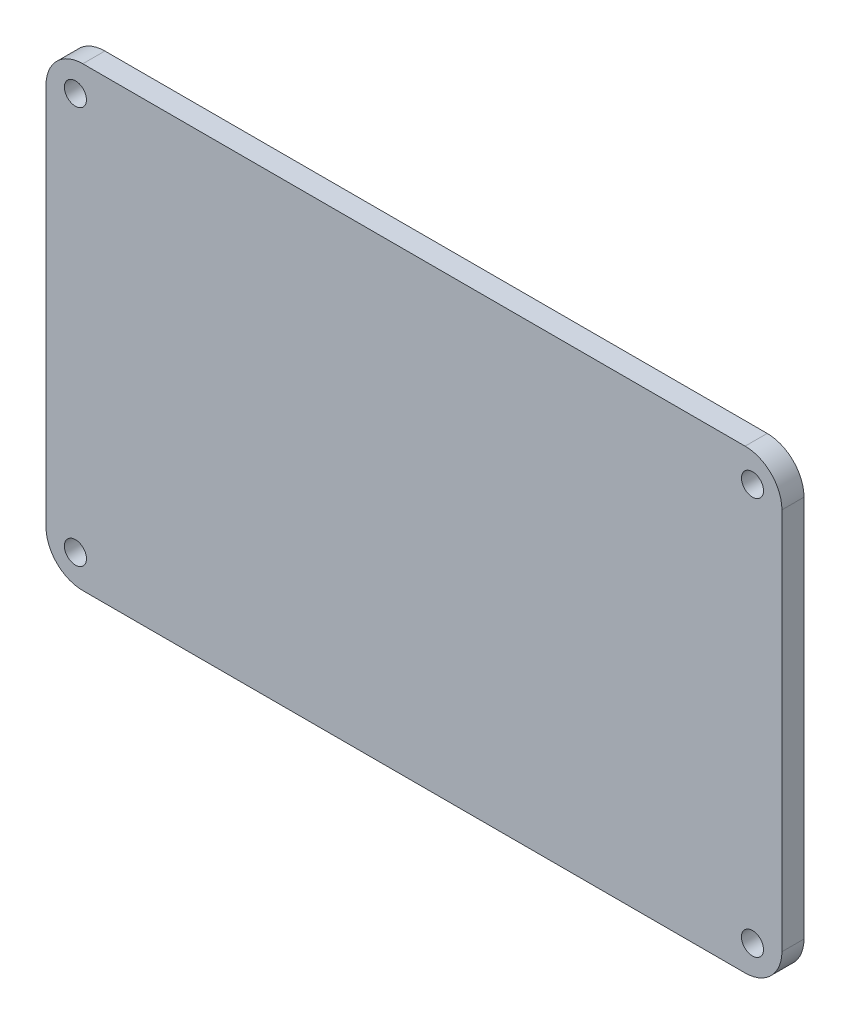
ISO-10303-21;
HEADER;
FILE_DESCRIPTION(('STEP AP214'),'2;1');
FILE_NAME('part.step','',(''),(''),'','','');
FILE_SCHEMA(('AUTOMOTIVE_DESIGN { 1 0 10303 214 1 1 1 1 }'));
ENDSEC;
DATA;
#1=APPLICATION_CONTEXT('core data for automotive mechanical design processes');
#2=APPLICATION_PROTOCOL_DEFINITION('international standard','automotive_design',2000,#1);
#3=PRODUCT_CONTEXT('',#1,'mechanical');
#4=PRODUCT('Part','Part','',(#3));
#5=PRODUCT_RELATED_PRODUCT_CATEGORY('part','',(#4));
#6=PRODUCT_DEFINITION_FORMATION('','',#4);
#7=PRODUCT_DEFINITION_CONTEXT('part definition',#1,'design');
#8=PRODUCT_DEFINITION('design','',#6,#7);
#9=PRODUCT_DEFINITION_SHAPE('','',#8);
#10=(LENGTH_UNIT() NAMED_UNIT(*) SI_UNIT(.MILLI.,.METRE.));
#11=(NAMED_UNIT(*) PLANE_ANGLE_UNIT() SI_UNIT($,.RADIAN.));
#12=(NAMED_UNIT(*) SI_UNIT($,.STERADIAN.) SOLID_ANGLE_UNIT());
#13=UNCERTAINTY_MEASURE_WITH_UNIT(LENGTH_MEASURE(1.E-05),#10,'distance_accuracy_value','');
#14=(GEOMETRIC_REPRESENTATION_CONTEXT(3) GLOBAL_UNCERTAINTY_ASSIGNED_CONTEXT((#13)) GLOBAL_UNIT_ASSIGNED_CONTEXT((#10,
#11,#12)) REPRESENTATION_CONTEXT('',''));
#15=CARTESIAN_POINT('',(0.,0.,0.));
#16=DIRECTION('',(0.,0.,1.));
#17=DIRECTION('',(1.,0.,0.));
#18=AXIS2_PLACEMENT_3D('',#15,#16,#17);
#19=CARTESIAN_POINT('',(-45.,26.,3.));
#20=DIRECTION('',(0.,0.,-1.));
#21=DIRECTION('',(-1.,0.,0.));
#22=AXIS2_PLACEMENT_3D('',#19,#20,#21);
#23=CYLINDRICAL_SURFACE('',#22,5.);
#24=CARTESIAN_POINT('',(-45.,26.,0.));
#25=DIRECTION('',(0.,0.,1.));
#26=DIRECTION('',(-1.,0.,0.));
#27=AXIS2_PLACEMENT_3D('',#24,#25,#26);
#28=CIRCLE('',#27,5.);
#29=CARTESIAN_POINT('',(-45.,31.,0.));
#30=VERTEX_POINT('',#29);
#31=CARTESIAN_POINT('',(-50.,26.,0.));
#32=VERTEX_POINT('',#31);
#33=EDGE_CURVE('E135',#30,#32,#28,.T.);
#34=ORIENTED_EDGE('',*,*,#33,.T.);
#35=DIRECTION('',(0.,0.,-1.));
#36=VECTOR('',#35,1.);
#37=CARTESIAN_POINT('',(-50.,26.,3.));
#38=LINE('',#37,#36);
#39=CARTESIAN_POINT('',(-50.,26.,3.));
#40=VERTEX_POINT('',#39);
#41=EDGE_CURVE('E11',#40,#32,#38,.T.);
#42=ORIENTED_EDGE('',*,*,#41,.F.);
#43=CARTESIAN_POINT('',(-45.,26.,3.));
#44=DIRECTION('',(0.,0.,1.));
#45=DIRECTION('',(-1.,0.,0.));
#46=AXIS2_PLACEMENT_3D('',#43,#44,#45);
#47=CIRCLE('',#46,5.);
#48=CARTESIAN_POINT('',(-45.,31.,3.));
#49=VERTEX_POINT('',#48);
#50=EDGE_CURVE('E150',#49,#40,#47,.T.);
#51=ORIENTED_EDGE('',*,*,#50,.F.);
#52=DIRECTION('',(0.,0.,-1.));
#53=VECTOR('',#52,1.);
#54=CARTESIAN_POINT('',(-45.,31.,3.));
#55=LINE('',#54,#53);
#56=EDGE_CURVE('E131',#49,#30,#55,.T.);
#57=ORIENTED_EDGE('',*,*,#56,.T.);
#58=EDGE_LOOP('',(#34,#42,#51,#57));
#59=FACE_BOUND('',#58,.T.);
#60=ADVANCED_FACE('F39',(#59),#23,.T.);
#61=CARTESIAN_POINT('',(-50.,26.,3.));
#62=DIRECTION('',(1.,0.,0.));
#63=DIRECTION('',(0.,1.,0.));
#64=AXIS2_PLACEMENT_3D('',#61,#62,#63);
#65=PLANE('',#64);
#66=DIRECTION('',(0.,-1.,0.));
#67=VECTOR('',#66,1.);
#68=CARTESIAN_POINT('',(-50.,26.,0.));
#69=LINE('',#68,#67);
#70=CARTESIAN_POINT('',(-50.,-26.,0.));
#71=VERTEX_POINT('',#70);
#72=EDGE_CURVE('E138',#32,#71,#69,.T.);
#73=ORIENTED_EDGE('',*,*,#72,.T.);
#74=DIRECTION('',(0.,0.,-1.));
#75=VECTOR('',#74,1.);
#76=CARTESIAN_POINT('',(-50.,-26.,3.));
#77=LINE('',#76,#75);
#78=CARTESIAN_POINT('',(-50.,-26.,3.));
#79=VERTEX_POINT('',#78);
#80=EDGE_CURVE('E47',#79,#71,#77,.T.);
#81=ORIENTED_EDGE('',*,*,#80,.F.);
#82=DIRECTION('',(0.,-1.,0.));
#83=VECTOR('',#82,1.);
#84=CARTESIAN_POINT('',(-50.,26.,3.));
#85=LINE('',#84,#83);
#86=EDGE_CURVE('E98',#40,#79,#85,.T.);
#87=ORIENTED_EDGE('',*,*,#86,.F.);
#88=ORIENTED_EDGE('',*,*,#41,.T.);
#89=EDGE_LOOP('',(#73,#81,#87,#88));
#90=FACE_BOUND('',#89,.T.);
#91=ADVANCED_FACE('F232',(#90),#65,.F.);
#92=CARTESIAN_POINT('',(-45.,-26.,3.));
#93=DIRECTION('',(0.,0.,-1.));
#94=DIRECTION('',(-1.,0.,0.));
#95=AXIS2_PLACEMENT_3D('',#92,#93,#94);
#96=CYLINDRICAL_SURFACE('',#95,5.);
#97=CARTESIAN_POINT('',(-45.,-26.,0.));
#98=DIRECTION('',(0.,0.,1.));
#99=DIRECTION('',(-1.,0.,0.));
#100=AXIS2_PLACEMENT_3D('',#97,#98,#99);
#101=CIRCLE('',#100,5.);
#102=CARTESIAN_POINT('',(-45.,-31.,0.));
#103=VERTEX_POINT('',#102);
#104=EDGE_CURVE('E141',#71,#103,#101,.T.);
#105=ORIENTED_EDGE('',*,*,#104,.T.);
#106=DIRECTION('',(0.,0.,-1.));
#107=VECTOR('',#106,1.);
#108=CARTESIAN_POINT('',(-45.,-31.,3.));
#109=LINE('',#108,#107);
#110=CARTESIAN_POINT('',(-45.,-31.,3.));
#111=VERTEX_POINT('',#110);
#112=EDGE_CURVE('E157',#111,#103,#109,.T.);
#113=ORIENTED_EDGE('',*,*,#112,.F.);
#114=CARTESIAN_POINT('',(-45.,-26.,3.));
#115=DIRECTION('',(0.,0.,1.));
#116=DIRECTION('',(-1.,0.,0.));
#117=AXIS2_PLACEMENT_3D('',#114,#115,#116);
#118=CIRCLE('',#117,5.);
#119=EDGE_CURVE('E165',#79,#111,#118,.T.);
#120=ORIENTED_EDGE('',*,*,#119,.F.);
#121=ORIENTED_EDGE('',*,*,#80,.T.);
#122=EDGE_LOOP('',(#105,#113,#120,#121));
#123=FACE_BOUND('',#122,.T.);
#124=ADVANCED_FACE('F163',(#123),#96,.T.);
#125=CARTESIAN_POINT('',(-45.,-31.,3.));
#126=DIRECTION('',(0.,1.,0.));
#127=DIRECTION('',(0.,0.,1.));
#128=AXIS2_PLACEMENT_3D('',#125,#126,#127);
#129=PLANE('',#128);
#130=DIRECTION('',(1.,0.,0.));
#131=VECTOR('',#130,1.);
#132=CARTESIAN_POINT('',(-45.,-31.,0.));
#133=LINE('',#132,#131);
#134=CARTESIAN_POINT('',(44.9999999999999,-31.,0.));
#135=VERTEX_POINT('',#134);
#136=EDGE_CURVE('E143',#103,#135,#133,.T.);
#137=ORIENTED_EDGE('',*,*,#136,.T.);
#138=DIRECTION('',(0.,0.,-1.));
#139=VECTOR('',#138,1.);
#140=CARTESIAN_POINT('',(44.9999999999999,-31.,3.));
#141=LINE('',#140,#139);
#142=CARTESIAN_POINT('',(44.9999999999999,-31.,3.));
#143=VERTEX_POINT('',#142);
#144=EDGE_CURVE('E154',#143,#135,#141,.T.);
#145=ORIENTED_EDGE('',*,*,#144,.F.);
#146=DIRECTION('',(1.,0.,0.));
#147=VECTOR('',#146,1.);
#148=CARTESIAN_POINT('',(-45.,-31.,3.));
#149=LINE('',#148,#147);
#150=EDGE_CURVE('E177',#111,#143,#149,.T.);
#151=ORIENTED_EDGE('',*,*,#150,.F.);
#152=ORIENTED_EDGE('',*,*,#112,.T.);
#153=EDGE_LOOP('',(#137,#145,#151,#152));
#154=FACE_BOUND('',#153,.T.);
#155=ADVANCED_FACE('F173',(#154),#129,.F.);
#156=CARTESIAN_POINT('',(45.,-26.,3.));
#157=DIRECTION('',(0.,0.,-1.));
#158=DIRECTION('',(-1.,0.,0.));
#159=AXIS2_PLACEMENT_3D('',#156,#157,#158);
#160=CYLINDRICAL_SURFACE('',#159,5.);
#161=CARTESIAN_POINT('',(45.,-26.,0.));
#162=DIRECTION('',(0.,0.,1.));
#163=DIRECTION('',(1.,0.,0.));
#164=AXIS2_PLACEMENT_3D('',#161,#162,#163);
#165=CIRCLE('',#164,5.);
#166=CARTESIAN_POINT('',(50.,-26.,0.));
#167=VERTEX_POINT('',#166);
#168=EDGE_CURVE('E145',#135,#167,#165,.T.);
#169=ORIENTED_EDGE('',*,*,#168,.T.);
#170=DIRECTION('',(0.,0.,-1.));
#171=VECTOR('',#170,1.);
#172=CARTESIAN_POINT('',(50.,-26.,3.));
#173=LINE('',#172,#171);
#174=CARTESIAN_POINT('',(50.,-26.,3.));
#175=VERTEX_POINT('',#174);
#176=EDGE_CURVE('E126',#175,#167,#173,.T.);
#177=ORIENTED_EDGE('',*,*,#176,.F.);
#178=CARTESIAN_POINT('',(45.,-26.,3.));
#179=DIRECTION('',(0.,0.,1.));
#180=DIRECTION('',(1.,0.,0.));
#181=AXIS2_PLACEMENT_3D('',#178,#179,#180);
#182=CIRCLE('',#181,5.);
#183=EDGE_CURVE('E117',#143,#175,#182,.T.);
#184=ORIENTED_EDGE('',*,*,#183,.F.);
#185=ORIENTED_EDGE('',*,*,#144,.T.);
#186=EDGE_LOOP('',(#169,#177,#184,#185));
#187=FACE_BOUND('',#186,.T.);
#188=ADVANCED_FACE('F176',(#187),#160,.T.);
#189=CARTESIAN_POINT('',(50.,26.,3.));
#190=DIRECTION('',(-1.,0.,0.));
#191=DIRECTION('',(0.,-1.,0.));
#192=AXIS2_PLACEMENT_3D('',#189,#190,#191);
#193=PLANE('',#192);
#194=DIRECTION('',(0.,1.,0.));
#195=VECTOR('',#194,1.);
#196=CARTESIAN_POINT('',(50.,26.,0.));
#197=LINE('',#196,#195);
#198=CARTESIAN_POINT('',(50.,26.,0.));
#199=VERTEX_POINT('',#198);
#200=EDGE_CURVE('E125',#167,#199,#197,.T.);
#201=ORIENTED_EDGE('',*,*,#200,.T.);
#202=DIRECTION('',(0.,0.,-1.));
#203=VECTOR('',#202,1.);
#204=CARTESIAN_POINT('',(50.,26.,3.));
#205=LINE('',#204,#203);
#206=CARTESIAN_POINT('',(50.,26.,3.));
#207=VERTEX_POINT('',#206);
#208=EDGE_CURVE('E122',#207,#199,#205,.T.);
#209=ORIENTED_EDGE('',*,*,#208,.F.);
#210=DIRECTION('',(0.,1.,0.));
#211=VECTOR('',#210,1.);
#212=CARTESIAN_POINT('',(50.,26.,3.));
#213=LINE('',#212,#211);
#214=EDGE_CURVE('E111',#175,#207,#213,.T.);
#215=ORIENTED_EDGE('',*,*,#214,.F.);
#216=ORIENTED_EDGE('',*,*,#176,.T.);
#217=EDGE_LOOP('',(#201,#209,#215,#216));
#218=FACE_BOUND('',#217,.T.);
#219=ADVANCED_FACE('F123',(#218),#193,.F.);
#220=CARTESIAN_POINT('',(45.,26.,3.));
#221=DIRECTION('',(0.,0.,-1.));
#222=DIRECTION('',(-1.,0.,0.));
#223=AXIS2_PLACEMENT_3D('',#220,#221,#222);
#224=CYLINDRICAL_SURFACE('',#223,5.);
#225=CARTESIAN_POINT('',(45.,26.,0.));
#226=DIRECTION('',(0.,0.,1.));
#227=DIRECTION('',(1.,0.,0.));
#228=AXIS2_PLACEMENT_3D('',#225,#226,#227);
#229=CIRCLE('',#228,5.);
#230=CARTESIAN_POINT('',(44.9999999999999,31.,0.));
#231=VERTEX_POINT('',#230);
#232=EDGE_CURVE('E84',#199,#231,#229,.T.);
#233=ORIENTED_EDGE('',*,*,#232,.T.);
#234=DIRECTION('',(0.,0.,-1.));
#235=VECTOR('',#234,1.);
#236=CARTESIAN_POINT('',(44.9999999999999,31.,3.));
#237=LINE('',#236,#235);
#238=CARTESIAN_POINT('',(44.9999999999999,31.,3.));
#239=VERTEX_POINT('',#238);
#240=EDGE_CURVE('E127',#239,#231,#237,.T.);
#241=ORIENTED_EDGE('',*,*,#240,.F.);
#242=CARTESIAN_POINT('',(45.,26.,3.));
#243=DIRECTION('',(0.,0.,1.));
#244=DIRECTION('',(1.,0.,0.));
#245=AXIS2_PLACEMENT_3D('',#242,#243,#244);
#246=CIRCLE('',#245,5.);
#247=EDGE_CURVE('E115',#207,#239,#246,.T.);
#248=ORIENTED_EDGE('',*,*,#247,.F.);
#249=ORIENTED_EDGE('',*,*,#208,.T.);
#250=EDGE_LOOP('',(#233,#241,#248,#249));
#251=FACE_BOUND('',#250,.T.);
#252=ADVANCED_FACE('F129',(#251),#224,.T.);
#253=CARTESIAN_POINT('',(-45.,31.,3.));
#254=DIRECTION('',(0.,-1.,0.));
#255=DIRECTION('',(0.,0.,-1.));
#256=AXIS2_PLACEMENT_3D('',#253,#254,#255);
#257=PLANE('',#256);
#258=DIRECTION('',(-1.,0.,0.));
#259=VECTOR('',#258,1.);
#260=CARTESIAN_POINT('',(-45.,31.,0.));
#261=LINE('',#260,#259);
#262=EDGE_CURVE('E90',#231,#30,#261,.T.);
#263=ORIENTED_EDGE('',*,*,#262,.T.);
#264=ORIENTED_EDGE('',*,*,#56,.F.);
#265=DIRECTION('',(-1.,0.,0.));
#266=VECTOR('',#265,1.);
#267=CARTESIAN_POINT('',(-45.,31.,3.));
#268=LINE('',#267,#266);
#269=EDGE_CURVE('E55',#239,#49,#268,.T.);
#270=ORIENTED_EDGE('',*,*,#269,.F.);
#271=ORIENTED_EDGE('',*,*,#240,.T.);
#272=EDGE_LOOP('',(#263,#264,#270,#271));
#273=FACE_BOUND('',#272,.T.);
#274=ADVANCED_FACE('F211',(#273),#257,.F.);
#275=CARTESIAN_POINT('',(-45.,26.,3.));
#276=DIRECTION('',(0.,0.,-1.));
#277=DIRECTION('',(-1.,0.,0.));
#278=AXIS2_PLACEMENT_3D('',#275,#276,#277);
#279=PLANE('',#278);
#280=CARTESIAN_POINT('',(46.,27.,3.));
#281=DIRECTION('',(0.,0.,1.));
#282=DIRECTION('',(1.,0.,0.));
#283=AXIS2_PLACEMENT_3D('',#280,#281,#282);
#284=CIRCLE('',#283,1.5);
#285=CARTESIAN_POINT('',(47.5,27.,3.));
#286=VERTEX_POINT('',#285);
#287=EDGE_CURVE('E186',#286,#286,#284,.T.);
#288=ORIENTED_EDGE('',*,*,#287,.F.);
#289=EDGE_LOOP('',(#288));
#290=FACE_BOUND('',#289,.T.);
#291=CARTESIAN_POINT('',(-46.,-27.,3.));
#292=DIRECTION('',(0.,0.,1.));
#293=DIRECTION('',(1.,0.,0.));
#294=AXIS2_PLACEMENT_3D('',#291,#292,#293);
#295=CIRCLE('',#294,1.5);
#296=CARTESIAN_POINT('',(-44.5,-27.,3.));
#297=VERTEX_POINT('',#296);
#298=EDGE_CURVE('E192',#297,#297,#295,.T.);
#299=ORIENTED_EDGE('',*,*,#298,.F.);
#300=EDGE_LOOP('',(#299));
#301=FACE_BOUND('',#300,.T.);
#302=CARTESIAN_POINT('',(46.,-27.,3.));
#303=DIRECTION('',(0.,0.,1.));
#304=DIRECTION('',(1.,0.,0.));
#305=AXIS2_PLACEMENT_3D('',#302,#303,#304);
#306=CIRCLE('',#305,1.5);
#307=CARTESIAN_POINT('',(47.5,-27.,3.));
#308=VERTEX_POINT('',#307);
#309=EDGE_CURVE('E193',#308,#308,#306,.T.);
#310=ORIENTED_EDGE('',*,*,#309,.F.);
#311=EDGE_LOOP('',(#310));
#312=FACE_BOUND('',#311,.T.);
#313=CARTESIAN_POINT('',(-46.,27.,3.));
#314=DIRECTION('',(0.,0.,1.));
#315=DIRECTION('',(1.,0.,0.));
#316=AXIS2_PLACEMENT_3D('',#313,#314,#315);
#317=CIRCLE('',#316,1.5);
#318=CARTESIAN_POINT('',(-44.5,27.,3.));
#319=VERTEX_POINT('',#318);
#320=EDGE_CURVE('E183',#319,#319,#317,.T.);
#321=ORIENTED_EDGE('',*,*,#320,.F.);
#322=EDGE_LOOP('',(#321));
#323=FACE_BOUND('',#322,.T.);
#324=ORIENTED_EDGE('',*,*,#50,.T.);
#325=ORIENTED_EDGE('',*,*,#86,.T.);
#326=ORIENTED_EDGE('',*,*,#119,.T.);
#327=ORIENTED_EDGE('',*,*,#150,.T.);
#328=ORIENTED_EDGE('',*,*,#183,.T.);
#329=ORIENTED_EDGE('',*,*,#214,.T.);
#330=ORIENTED_EDGE('',*,*,#247,.T.);
#331=ORIENTED_EDGE('',*,*,#269,.T.);
#332=EDGE_LOOP('',(#324,#325,#326,#327,#328,#329,#330,#331));
#333=FACE_BOUND('',#332,.T.);
#334=ADVANCED_FACE('F113',(#290,#301,#312,#323,#333),#279,.F.);
#335=CARTESIAN_POINT('',(-45.,26.,0.));
#336=DIRECTION('',(0.,0.,-1.));
#337=DIRECTION('',(-1.,0.,0.));
#338=AXIS2_PLACEMENT_3D('',#335,#336,#337);
#339=PLANE('',#338);
#340=CARTESIAN_POINT('',(46.,27.,0.));
#341=DIRECTION('',(0.,0.,1.));
#342=DIRECTION('',(1.,0.,0.));
#343=AXIS2_PLACEMENT_3D('',#340,#341,#342);
#344=CIRCLE('',#343,1.5);
#345=CARTESIAN_POINT('',(47.5,27.,0.));
#346=VERTEX_POINT('',#345);
#347=EDGE_CURVE('E196',#346,#346,#344,.T.);
#348=ORIENTED_EDGE('',*,*,#347,.T.);
#349=EDGE_LOOP('',(#348));
#350=FACE_BOUND('',#349,.T.);
#351=CARTESIAN_POINT('',(-46.,-27.,0.));
#352=DIRECTION('',(0.,0.,1.));
#353=DIRECTION('',(1.,0.,0.));
#354=AXIS2_PLACEMENT_3D('',#351,#352,#353);
#355=CIRCLE('',#354,1.5);
#356=CARTESIAN_POINT('',(-44.5,-27.,0.));
#357=VERTEX_POINT('',#356);
#358=EDGE_CURVE('E189',#357,#357,#355,.T.);
#359=ORIENTED_EDGE('',*,*,#358,.T.);
#360=EDGE_LOOP('',(#359));
#361=FACE_BOUND('',#360,.T.);
#362=CARTESIAN_POINT('',(46.,-27.,0.));
#363=DIRECTION('',(0.,0.,1.));
#364=DIRECTION('',(1.,0.,0.));
#365=AXIS2_PLACEMENT_3D('',#362,#363,#364);
#366=CIRCLE('',#365,1.5);
#367=CARTESIAN_POINT('',(47.5,-27.,0.));
#368=VERTEX_POINT('',#367);
#369=EDGE_CURVE('E201',#368,#368,#366,.T.);
#370=ORIENTED_EDGE('',*,*,#369,.T.);
#371=EDGE_LOOP('',(#370));
#372=FACE_BOUND('',#371,.T.);
#373=CARTESIAN_POINT('',(-46.,27.,0.));
#374=DIRECTION('',(0.,0.,1.));
#375=DIRECTION('',(1.,0.,0.));
#376=AXIS2_PLACEMENT_3D('',#373,#374,#375);
#377=CIRCLE('',#376,1.5);
#378=CARTESIAN_POINT('',(-44.5,27.,0.));
#379=VERTEX_POINT('',#378);
#380=EDGE_CURVE('E139',#379,#379,#377,.T.);
#381=ORIENTED_EDGE('',*,*,#380,.T.);
#382=EDGE_LOOP('',(#381));
#383=FACE_BOUND('',#382,.T.);
#384=ORIENTED_EDGE('',*,*,#33,.F.);
#385=ORIENTED_EDGE('',*,*,#262,.F.);
#386=ORIENTED_EDGE('',*,*,#232,.F.);
#387=ORIENTED_EDGE('',*,*,#200,.F.);
#388=ORIENTED_EDGE('',*,*,#168,.F.);
#389=ORIENTED_EDGE('',*,*,#136,.F.);
#390=ORIENTED_EDGE('',*,*,#104,.F.);
#391=ORIENTED_EDGE('',*,*,#72,.F.);
#392=EDGE_LOOP('',(#384,#385,#386,#387,#388,#389,#390,#391));
#393=FACE_BOUND('',#392,.T.);
#394=ADVANCED_FACE('F169',(#350,#361,#372,#383,#393),#339,.T.);
#395=CARTESIAN_POINT('',(-46.,27.,0.));
#396=DIRECTION('',(0.,0.,1.));
#397=DIRECTION('',(1.,0.,0.));
#398=AXIS2_PLACEMENT_3D('',#395,#396,#397);
#399=CYLINDRICAL_SURFACE('',#398,1.5);
#400=ORIENTED_EDGE('',*,*,#380,.F.);
#401=EDGE_LOOP('',(#400));
#402=FACE_BOUND('',#401,.T.);
#403=ORIENTED_EDGE('',*,*,#320,.T.);
#404=EDGE_LOOP('',(#403));
#405=FACE_BOUND('',#404,.T.);
#406=ADVANCED_FACE('F216',(#402,#405),#399,.F.);
#407=CARTESIAN_POINT('',(46.,-27.,0.));
#408=DIRECTION('',(0.,0.,1.));
#409=DIRECTION('',(1.,0.,0.));
#410=AXIS2_PLACEMENT_3D('',#407,#408,#409);
#411=CYLINDRICAL_SURFACE('',#410,1.5);
#412=ORIENTED_EDGE('',*,*,#369,.F.);
#413=EDGE_LOOP('',(#412));
#414=FACE_BOUND('',#413,.T.);
#415=ORIENTED_EDGE('',*,*,#309,.T.);
#416=EDGE_LOOP('',(#415));
#417=FACE_BOUND('',#416,.T.);
#418=ADVANCED_FACE('F207',(#414,#417),#411,.F.);
#419=CARTESIAN_POINT('',(-46.,-27.,0.));
#420=DIRECTION('',(0.,0.,1.));
#421=DIRECTION('',(1.,0.,0.));
#422=AXIS2_PLACEMENT_3D('',#419,#420,#421);
#423=CYLINDRICAL_SURFACE('',#422,1.5);
#424=ORIENTED_EDGE('',*,*,#358,.F.);
#425=EDGE_LOOP('',(#424));
#426=FACE_BOUND('',#425,.T.);
#427=ORIENTED_EDGE('',*,*,#298,.T.);
#428=EDGE_LOOP('',(#427));
#429=FACE_BOUND('',#428,.T.);
#430=ADVANCED_FACE('F224',(#426,#429),#423,.F.);
#431=CARTESIAN_POINT('',(46.,27.,0.));
#432=DIRECTION('',(0.,0.,1.));
#433=DIRECTION('',(1.,0.,0.));
#434=AXIS2_PLACEMENT_3D('',#431,#432,#433);
#435=CYLINDRICAL_SURFACE('',#434,1.5);
#436=ORIENTED_EDGE('',*,*,#347,.F.);
#437=EDGE_LOOP('',(#436));
#438=FACE_BOUND('',#437,.T.);
#439=ORIENTED_EDGE('',*,*,#287,.T.);
#440=EDGE_LOOP('',(#439));
#441=FACE_BOUND('',#440,.T.);
#442=ADVANCED_FACE('F314',(#438,#441),#435,.F.);
#443=CLOSED_SHELL('',(#60,#91,#124,#155,#188,#219,#252,#274,#334,#394,#406,#418,#430,#442));
#444=MANIFOLD_SOLID_BREP('B2',#443);
#445=ADVANCED_BREP_SHAPE_REPRESENTATION('',(#18,#444),#14);
#446=SHAPE_DEFINITION_REPRESENTATION(#9,#445);
ENDSEC;
END-ISO-10303-21;
